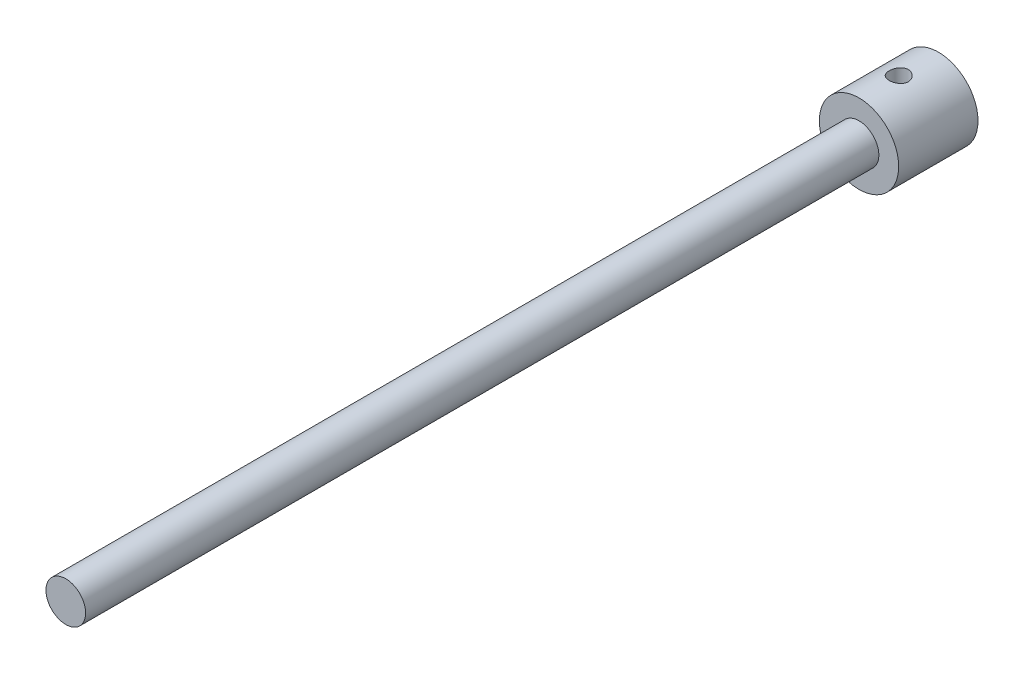
ISO-10303-21;
HEADER;
FILE_DESCRIPTION(('STEP AP214'),'2;1');
FILE_NAME('part.step','',(''),(''),'','','');
FILE_SCHEMA(('AUTOMOTIVE_DESIGN { 1 0 10303 214 1 1 1 1 }'));
ENDSEC;
DATA;
#1=APPLICATION_CONTEXT('core data for automotive mechanical design processes');
#2=APPLICATION_PROTOCOL_DEFINITION('international standard','automotive_design',2000,#1);
#3=PRODUCT_CONTEXT('',#1,'mechanical');
#4=PRODUCT('Part','Part','',(#3));
#5=PRODUCT_RELATED_PRODUCT_CATEGORY('part','',(#4));
#6=PRODUCT_DEFINITION_FORMATION('','',#4);
#7=PRODUCT_DEFINITION_CONTEXT('part definition',#1,'design');
#8=PRODUCT_DEFINITION('design','',#6,#7);
#9=PRODUCT_DEFINITION_SHAPE('','',#8);
#10=(LENGTH_UNIT() NAMED_UNIT(*) SI_UNIT(.MILLI.,.METRE.));
#11=(NAMED_UNIT(*) PLANE_ANGLE_UNIT() SI_UNIT($,.RADIAN.));
#12=(NAMED_UNIT(*) SI_UNIT($,.STERADIAN.) SOLID_ANGLE_UNIT());
#13=UNCERTAINTY_MEASURE_WITH_UNIT(LENGTH_MEASURE(1.E-05),#10,'distance_accuracy_value','');
#14=(GEOMETRIC_REPRESENTATION_CONTEXT(3) GLOBAL_UNCERTAINTY_ASSIGNED_CONTEXT((#13)) GLOBAL_UNIT_ASSIGNED_CONTEXT((#10,
#11,#12)) REPRESENTATION_CONTEXT('',''));
#15=CARTESIAN_POINT('',(0.,0.,0.));
#16=DIRECTION('',(0.,0.,1.));
#17=DIRECTION('',(1.,0.,0.));
#18=AXIS2_PLACEMENT_3D('',#15,#16,#17);
#19=CARTESIAN_POINT('',(0.,0.,50.));
#20=DIRECTION('',(0.,0.,-1.));
#21=DIRECTION('',(-1.,0.,0.));
#22=AXIS2_PLACEMENT_3D('',#19,#20,#21);
#23=CYLINDRICAL_SURFACE('',#22,25.);
#24=CARTESIAN_POINT('',(0.,-25.,31.));
#25=CARTESIAN_POINT('',(0.166017736340745,-25.0000026804997,31.0000045654021));
#26=CARTESIAN_POINT('',(0.331984064130571,-24.9983437383731,30.9931083315099));
#27=CARTESIAN_POINT('',(0.662757375273785,-24.9917601768854,30.9655909900526));
#28=CARTESIAN_POINT('',(0.827564209779564,-24.9868351457074,30.9449681517169));
#29=CARTESIAN_POINT('',(1.15483168687375,-24.9738504635424,30.8901535848326));
#30=CARTESIAN_POINT('',(1.31729147606247,-24.9657897007271,30.855957043403));
#31=CARTESIAN_POINT('',(1.63872050759381,-24.9467537443302,30.7742619207701));
#32=CARTESIAN_POINT('',(1.79768844089951,-24.9357774773038,30.7267584397992));
#33=CARTESIAN_POINT('',(2.11072366381165,-24.9112316091515,30.6189154000372));
#34=CARTESIAN_POINT('',(2.26479812859838,-24.897666030887,30.5585957367627));
#35=CARTESIAN_POINT('',(2.56731972417304,-24.8682925860487,30.4255126504005));
#36=CARTESIAN_POINT('',(2.71576475309531,-24.8524838922068,30.3527446342751));
#37=CARTESIAN_POINT('',(3.00593509691774,-24.8190587739081,30.1953429094483));
#38=CARTESIAN_POINT('',(3.14766294672407,-24.8014430394569,30.1107137253609));
#39=CARTESIAN_POINT('',(3.42359889441685,-24.7648612187919,29.930128760191));
#40=CARTESIAN_POINT('',(3.55780414185136,-24.7458946268123,29.8341687278593));
#41=CARTESIAN_POINT('',(3.81996752921303,-24.7067947855154,29.6298945004368));
#42=CARTESIAN_POINT('',(3.94778319107671,-24.6866473068088,29.5214001376863));
#43=CARTESIAN_POINT('',(4.19391043753479,-24.6460277155742,29.2940876458784));
#44=CARTESIAN_POINT('',(4.31221847908384,-24.6255554853983,29.1752657022346));
#45=CARTESIAN_POINT('',(4.53846894982133,-24.5848634527513,28.9281491358483));
#46=CARTESIAN_POINT('',(4.64641408237687,-24.5646435856504,28.7998569991231));
#47=CARTESIAN_POINT('',(4.85128465634762,-24.5250062264423,28.5345631328875));
#48=CARTESIAN_POINT('',(4.94820601608992,-24.5055890332168,28.3975582064557));
#49=CARTESIAN_POINT('',(5.1315149308875,-24.4678652790419,28.1139109412451));
#50=CARTESIAN_POINT('',(5.21774615640803,-24.4495768107614,27.9671650785524));
#51=CARTESIAN_POINT('',(5.37754406139993,-24.4149279468241,27.6666458172853));
#52=CARTESIAN_POINT('',(5.45110595933349,-24.3985682798489,27.5128697930405));
#53=CARTESIAN_POINT('',(5.58492026214268,-24.3682865029779,27.1994677660297));
#54=CARTESIAN_POINT('',(5.64517912327471,-24.354363211339,27.0398446450393));
#55=CARTESIAN_POINT('',(5.75195806967358,-24.3293636773731,26.7158528745254));
#56=CARTESIAN_POINT('',(5.79847322039683,-24.318288457803,26.5514825437586));
#57=CARTESIAN_POINT('',(5.91523377010968,-24.2902598679583,26.0591991958386));
#58=CARTESIAN_POINT('',(5.96534620186162,-24.2778811042379,25.7258747491139));
#59=CARTESIAN_POINT('',(5.99819895021148,-24.2697663322526,25.2235243982438));
#60=CARTESIAN_POINT('',(6.00209048242323,-24.2688053008257,25.055614512631));
#61=CARTESIAN_POINT('',(5.99581246294926,-24.2703574949623,24.7200533387406));
#62=CARTESIAN_POINT('',(5.98564275494965,-24.2728707591485,24.5524020533586));
#63=CARTESIAN_POINT('',(5.93483975630032,-24.285368999466,24.0592354379643));
#64=CARTESIAN_POINT('',(5.87440247397774,-24.3001939850224,23.7356610926301));
#65=CARTESIAN_POINT('',(5.70184242669472,-24.3412549446464,23.1035551402389));
#66=CARTESIAN_POINT('',(5.58971623816142,-24.3674916745551,22.7950245310886));
#67=CARTESIAN_POINT('',(5.3158825349441,-24.4286958367201,22.1981876883057));
#68=CARTESIAN_POINT('',(5.15371899452585,-24.4637429965247,21.9100987536133));
#69=CARTESIAN_POINT('',(4.78473374953622,-24.5385748778448,21.3647873385141));
#70=CARTESIAN_POINT('',(4.57790479882186,-24.5783603675971,21.1075698769834));
#71=CARTESIAN_POINT('',(4.11902988641842,-24.6594640880418,20.6242138778088));
#72=CARTESIAN_POINT('',(3.86594129003371,-24.7007951674045,20.3990660746999));
#73=CARTESIAN_POINT('',(3.32511184695823,-24.7793903091839,19.9942302876759));
#74=CARTESIAN_POINT('',(3.03737009894219,-24.8166542657671,19.8145434865743));
#75=CARTESIAN_POINT('',(2.43405695507431,-24.8830789940348,19.5054056318309));
#76=CARTESIAN_POINT('',(2.11840557448716,-24.9122154123614,19.3761051057317));
#77=CARTESIAN_POINT('',(1.46899521159138,-24.9589240940734,19.1726698236987));
#78=CARTESIAN_POINT('',(1.13523942521409,-24.9764983913503,19.0985253649671));
#79=CARTESIAN_POINT('',(0.467574800827576,-24.9978055089126,19.0089958704804));
#80=CARTESIAN_POINT('',(0.133856966575299,-25.0018564268946,18.9922601968733));
#81=CARTESIAN_POINT('',(-0.531608768658084,-24.9965614831509,19.0143335519038));
#82=CARTESIAN_POINT('',(-0.863356829944318,-24.9872167270307,19.053137996564));
#83=CARTESIAN_POINT('',(-1.51084514007902,-24.9563832816127,19.1840738854237));
#84=CARTESIAN_POINT('',(-1.8267410839496,-24.9350603275565,19.2754779523593));
#85=CARTESIAN_POINT('',(-2.4387066749497,-24.8826669936479,19.5081966502045));
#86=CARTESIAN_POINT('',(-2.73477441187556,-24.8515956762951,19.6495160816406));
#87=CARTESIAN_POINT('',(-3.30412273668564,-24.7823820658762,19.9807321749523));
#88=CARTESIAN_POINT('',(-3.57694246966835,-24.7441307708391,20.171397626969));
#89=CARTESIAN_POINT('',(-4.08719914724013,-24.6649871461435,20.5949176655097));
#90=CARTESIAN_POINT('',(-4.32463047973872,-24.6240943990595,20.8277789307352));
#91=CARTESIAN_POINT('',(-4.76284500809665,-24.5431489449983,21.3352671241417));
#92=CARTESIAN_POINT('',(-4.96268414096836,-24.5031358001301,21.6107154179113));
#93=CARTESIAN_POINT('',(-5.31333575577366,-24.4295058119813,22.1922356795911));
#94=CARTESIAN_POINT('',(-5.46415043292341,-24.395888682328,22.4983062754937));
#95=CARTESIAN_POINT('',(-5.64963439053452,-24.353347630646,22.9725936839859));
#96=CARTESIAN_POINT('',(-5.70458710242878,-24.3405033891164,23.1328069566145));
#97=CARTESIAN_POINT('',(-5.80079732294279,-24.317755202926,23.4574820200321));
#98=CARTESIAN_POINT('',(-5.84205998439171,-24.3078501521252,23.6219421871433));
#99=CARTESIAN_POINT('',(-5.91053741786634,-24.2912903166139,23.9539179032293));
#100=CARTESIAN_POINT('',(-5.93775173433046,-24.2846356373073,24.1214335511052));
#101=CARTESIAN_POINT('',(-5.97789965204539,-24.2747841701866,24.4582664668551));
#102=CARTESIAN_POINT('',(-5.99083389159895,-24.2715872278157,24.6275836538608));
#103=CARTESIAN_POINT('',(-6.00215499594078,-24.2687899616173,24.9622487305118));
#104=CARTESIAN_POINT('',(-6.00091722515411,-24.2690968340135,25.1275832844736));
#105=CARTESIAN_POINT('',(-5.9848087278487,-24.2730742483489,25.4575435219348));
#106=CARTESIAN_POINT('',(-5.96993829850501,-24.2767447169658,25.6221692208079));
#107=CARTESIAN_POINT('',(-5.92668661056588,-24.2873399112073,25.9495546015662));
#108=CARTESIAN_POINT('',(-5.89830323162515,-24.294265147542,26.1123139864983));
#109=CARTESIAN_POINT('',(-5.82827196779405,-24.3111608262961,26.4347302014815));
#110=CARTESIAN_POINT('',(-5.78662876790753,-24.3211301931022,26.5943881062501));
#111=CARTESIAN_POINT('',(-5.69063662986335,-24.3437686465433,26.9088075189712));
#112=CARTESIAN_POINT('',(-5.63634876916799,-24.3564247302984,27.0635886271826));
#113=CARTESIAN_POINT('',(-5.51539707483437,-24.3840980883562,27.3679533881392));
#114=CARTESIAN_POINT('',(-5.44873755154826,-24.3991145400161,27.5175388295994));
#115=CARTESIAN_POINT('',(-5.30348427217982,-24.4310987091682,27.8106621669156));
#116=CARTESIAN_POINT('',(-5.22488523075194,-24.4480672900111,27.9541973483356));
#117=CARTESIAN_POINT('',(-5.05635243091258,-24.4834782828489,28.2341911451689));
#118=CARTESIAN_POINT('',(-4.96642242689347,-24.5019202059306,28.3706520835145));
#119=CARTESIAN_POINT('',(-4.77346921711415,-24.5402505889388,28.6389503832923));
#120=CARTESIAN_POINT('',(-4.67017903544834,-24.5601634300573,28.7705923311298));
#121=CARTESIAN_POINT('',(-4.45304880482869,-24.600458146359,29.02470841849));
#122=CARTESIAN_POINT('',(-4.33921237965749,-24.6208398586377,29.1471856811229));
#123=CARTESIAN_POINT('',(-4.10164015488732,-24.661530300392,29.3822931129819));
#124=CARTESIAN_POINT('',(-3.97789855094998,-24.6818389796797,29.4949174263774));
#125=CARTESIAN_POINT('',(-3.7214296777047,-24.7218081005976,29.7094481047576));
#126=CARTESIAN_POINT('',(-3.58870570477298,-24.7414687761375,29.8113583669331));
#127=CARTESIAN_POINT('',(-3.31280088827595,-24.7799327781137,30.0054239224955));
#128=CARTESIAN_POINT('',(-3.16948213881108,-24.7987162302532,30.0973872483625));
#129=CARTESIAN_POINT('',(-2.8754381763477,-24.8345280560803,30.2688530722884));
#130=CARTESIAN_POINT('',(-2.72471571591035,-24.8515570748485,30.3483601559727));
#131=CARTESIAN_POINT('',(-2.41692354679156,-24.883375777664,30.4943122871475));
#132=CARTESIAN_POINT('',(-2.25985686316147,-24.8981665133663,30.5607634733439));
#133=CARTESIAN_POINT('',(-1.94048744711081,-24.9250921884147,30.6801042720391));
#134=CARTESIAN_POINT('',(-1.77818555787967,-24.9372275530119,30.7329960562763));
#135=CARTESIAN_POINT('',(-1.35190448336008,-24.9647957983314,30.8520251734541));
#136=CARTESIAN_POINT('',(-1.08469226075993,-24.9779181465939,30.9074241484908));
#137=CARTESIAN_POINT('',(-0.544940331071898,-24.9955177731159,30.9814066442059));
#138=CARTESIAN_POINT('',(-0.272400964328513,-24.9999956018512,30.999992509114));
#139=CARTESIAN_POINT('',(0.,-25.,31.));
#140=B_SPLINE_CURVE_WITH_KNOTS('',3,(#24,#25,#26,#27,#28,#29,#30,#31,#32,#33,#34,#35,#36,#37,
#38,#39,#40,#41,#42,#43,#44,#45,#46,#47,#48,#49,#50,#51,#52,#53,#54,#55,#56,#57,#58,#59,#60,#61,
#62,#63,#64,#65,#66,#67,#68,#69,#70,#71,#72,#73,#74,#75,#76,#77,#78,#79,#80,#81,#82,#83,#84,#85,
#86,#87,#88,#89,#90,#91,#92,#93,#94,#95,#96,#97,#98,#99,#100,#101,#102,#103,#104,#105,#106,#107,
#108,#109,#110,#111,#112,#113,#114,#115,#116,#117,#118,#119,#120,#121,#122,#123,#124,#125,#126,
#127,#128,#129,#130,#131,#132,#133,#134,#135,#136,#137,#138,#139),.UNSPECIFIED.,.T.,.F.,(4,2,2,
2,2,2,2,2,2,2,2,2,2,2,2,2,2,2,2,2,2,2,2,2,2,2,2,2,2,2,2,2,2,2,2,2,2,2,2,2,2,2,2,2,2,2,2,2,2,2,2,
2,2,2,2,2,2,4),(0.,0.497813360100955,0.995689500769748,1.49374233325073,1.99197879609469,
2.4894473877073,2.98709992652941,3.48456314269129,3.98221359994714,4.48820831908741,
4.99439073274951,5.50044073797176,6.00667750796929,6.51961190143619,7.03273945954076,
7.54561743540079,8.05867933189507,9.06463756237654,9.56800871792682,10.0713854693234,
11.0548629550303,12.0384055899336,13.0311908061742,14.0241372047509,15.0430966233895,
16.0620825507942,17.0840897493149,18.1059171185591,19.1035329919673,20.1010665323702,
21.085126203147,22.069280539993,23.0698021185097,24.0704821968969,25.0936623603892,
26.1167967016263,26.6258643414059,27.1347401541084,27.6436324676663,28.1525020334114,
28.6479253897995,29.1433379468293,29.6388282657176,30.1341437102249,30.6271145113295,
31.1199138801487,31.6129320389054,32.105787268885,32.6107272666003,33.1154944014541,
33.6205595212516,34.1254402854413,34.6387770201076,35.1519243293048,35.6648297831432,
36.1776530362049,36.9945144051894,37.8113237554193),.UNSPECIFIED.);
#141=CARTESIAN_POINT('',(0.,-25.,31.));
#142=VERTEX_POINT('',#141);
#143=EDGE_CURVE('E10',#142,#142,#140,.T.);
#144=ORIENTED_EDGE('',*,*,#143,.T.);
#145=EDGE_LOOP('',(#144));
#146=FACE_BOUND('',#145,.T.);
#147=CARTESIAN_POINT('',(0.,25.,31.));
#148=CARTESIAN_POINT('',(-0.166017736340745,25.0000026804997,31.0000045654021));
#149=CARTESIAN_POINT('',(-0.331984064130571,24.9983437383731,30.9931083315099));
#150=CARTESIAN_POINT('',(-0.662757375273785,24.9917601768854,30.9655909900526));
#151=CARTESIAN_POINT('',(-0.827564209779564,24.9868351457074,30.9449681517169));
#152=CARTESIAN_POINT('',(-1.15483168687375,24.9738504635424,30.8901535848326));
#153=CARTESIAN_POINT('',(-1.31729147606247,24.9657897007271,30.855957043403));
#154=CARTESIAN_POINT('',(-1.63872050759381,24.9467537443302,30.7742619207701));
#155=CARTESIAN_POINT('',(-1.79768844089951,24.9357774773038,30.7267584397992));
#156=CARTESIAN_POINT('',(-2.11072366381165,24.9112316091515,30.6189154000372));
#157=CARTESIAN_POINT('',(-2.26479812859838,24.897666030887,30.5585957367627));
#158=CARTESIAN_POINT('',(-2.56731972417304,24.8682925860487,30.4255126504005));
#159=CARTESIAN_POINT('',(-2.71576475309531,24.8524838922068,30.3527446342751));
#160=CARTESIAN_POINT('',(-3.00593509691774,24.8190587739081,30.1953429094483));
#161=CARTESIAN_POINT('',(-3.14766294672407,24.8014430394569,30.1107137253609));
#162=CARTESIAN_POINT('',(-3.42359889441685,24.7648612187919,29.930128760191));
#163=CARTESIAN_POINT('',(-3.55780414185136,24.7458946268123,29.8341687278593));
#164=CARTESIAN_POINT('',(-3.81996752921303,24.7067947855154,29.6298945004368));
#165=CARTESIAN_POINT('',(-3.94778319107671,24.6866473068088,29.5214001376863));
#166=CARTESIAN_POINT('',(-4.19391043753479,24.6460277155742,29.2940876458784));
#167=CARTESIAN_POINT('',(-4.31221847908384,24.6255554853983,29.1752657022346));
#168=CARTESIAN_POINT('',(-4.53846894982133,24.5848634527513,28.9281491358483));
#169=CARTESIAN_POINT('',(-4.64641408237687,24.5646435856504,28.7998569991231));
#170=CARTESIAN_POINT('',(-4.85128465634762,24.5250062264423,28.5345631328875));
#171=CARTESIAN_POINT('',(-4.94820601608992,24.5055890332168,28.3975582064557));
#172=CARTESIAN_POINT('',(-5.1315149308875,24.4678652790419,28.1139109412451));
#173=CARTESIAN_POINT('',(-5.21774615640803,24.4495768107614,27.9671650785524));
#174=CARTESIAN_POINT('',(-5.37754406139993,24.4149279468241,27.6666458172853));
#175=CARTESIAN_POINT('',(-5.45110595933349,24.3985682798489,27.5128697930405));
#176=CARTESIAN_POINT('',(-5.58492026214268,24.3682865029779,27.1994677660297));
#177=CARTESIAN_POINT('',(-5.64517912327471,24.354363211339,27.0398446450393));
#178=CARTESIAN_POINT('',(-5.75195806967358,24.3293636773731,26.7158528745254));
#179=CARTESIAN_POINT('',(-5.79847322039683,24.318288457803,26.5514825437586));
#180=CARTESIAN_POINT('',(-5.91523377010968,24.2902598679583,26.0591991958386));
#181=CARTESIAN_POINT('',(-5.96534620186162,24.2778811042379,25.7258747491139));
#182=CARTESIAN_POINT('',(-5.99819895021148,24.2697663322526,25.2235243982438));
#183=CARTESIAN_POINT('',(-6.00209048242323,24.2688053008257,25.055614512631));
#184=CARTESIAN_POINT('',(-5.99581246294926,24.2703574949623,24.7200533387406));
#185=CARTESIAN_POINT('',(-5.98564275494965,24.2728707591485,24.5524020533586));
#186=CARTESIAN_POINT('',(-5.93483975630032,24.285368999466,24.0592354379643));
#187=CARTESIAN_POINT('',(-5.87440247397774,24.3001939850224,23.7356610926301));
#188=CARTESIAN_POINT('',(-5.70184242669472,24.3412549446464,23.1035551402389));
#189=CARTESIAN_POINT('',(-5.58971623816142,24.3674916745551,22.7950245310886));
#190=CARTESIAN_POINT('',(-5.3158825349441,24.4286958367201,22.1981876883057));
#191=CARTESIAN_POINT('',(-5.15371899452585,24.4637429965247,21.9100987536133));
#192=CARTESIAN_POINT('',(-4.78473374953622,24.5385748778448,21.3647873385141));
#193=CARTESIAN_POINT('',(-4.57790479882186,24.5783603675971,21.1075698769834));
#194=CARTESIAN_POINT('',(-4.11902988641842,24.6594640880418,20.6242138778088));
#195=CARTESIAN_POINT('',(-3.86594129003371,24.7007951674045,20.3990660746999));
#196=CARTESIAN_POINT('',(-3.32511184695823,24.7793903091839,19.9942302876759));
#197=CARTESIAN_POINT('',(-3.03737009894219,24.8166542657671,19.8145434865743));
#198=CARTESIAN_POINT('',(-2.43405695507431,24.8830789940348,19.5054056318309));
#199=CARTESIAN_POINT('',(-2.11840557448716,24.9122154123614,19.3761051057317));
#200=CARTESIAN_POINT('',(-1.46899521159138,24.9589240940734,19.1726698236987));
#201=CARTESIAN_POINT('',(-1.13523942521409,24.9764983913503,19.0985253649671));
#202=CARTESIAN_POINT('',(-0.467574800827576,24.9978055089126,19.0089958704804));
#203=CARTESIAN_POINT('',(-0.133856966575299,25.0018564268946,18.9922601968733));
#204=CARTESIAN_POINT('',(0.531608768658084,24.9965614831509,19.0143335519038));
#205=CARTESIAN_POINT('',(0.863356829944318,24.9872167270307,19.053137996564));
#206=CARTESIAN_POINT('',(1.51084514007902,24.9563832816127,19.1840738854237));
#207=CARTESIAN_POINT('',(1.8267410839496,24.9350603275565,19.2754779523593));
#208=CARTESIAN_POINT('',(2.4387066749497,24.8826669936479,19.5081966502045));
#209=CARTESIAN_POINT('',(2.73477441187556,24.8515956762951,19.6495160816406));
#210=CARTESIAN_POINT('',(3.30412273668564,24.7823820658762,19.9807321749523));
#211=CARTESIAN_POINT('',(3.57694246966835,24.7441307708391,20.171397626969));
#212=CARTESIAN_POINT('',(4.08719914724013,24.6649871461435,20.5949176655097));
#213=CARTESIAN_POINT('',(4.32463047973872,24.6240943990595,20.8277789307352));
#214=CARTESIAN_POINT('',(4.76284500809665,24.5431489449983,21.3352671241417));
#215=CARTESIAN_POINT('',(4.96268414096836,24.5031358001301,21.6107154179113));
#216=CARTESIAN_POINT('',(5.31333575577366,24.4295058119813,22.1922356795911));
#217=CARTESIAN_POINT('',(5.46415043292341,24.395888682328,22.4983062754937));
#218=CARTESIAN_POINT('',(5.64963439053452,24.353347630646,22.9725936839859));
#219=CARTESIAN_POINT('',(5.70458710242878,24.3405033891164,23.1328069566145));
#220=CARTESIAN_POINT('',(5.80079732294279,24.317755202926,23.4574820200321));
#221=CARTESIAN_POINT('',(5.84205998439171,24.3078501521252,23.6219421871433));
#222=CARTESIAN_POINT('',(5.91053741786634,24.2912903166139,23.9539179032293));
#223=CARTESIAN_POINT('',(5.93775173433046,24.2846356373073,24.1214335511052));
#224=CARTESIAN_POINT('',(5.97789965204539,24.2747841701866,24.4582664668551));
#225=CARTESIAN_POINT('',(5.99083389159895,24.2715872278157,24.6275836538608));
#226=CARTESIAN_POINT('',(6.00215499594078,24.2687899616173,24.9622487305118));
#227=CARTESIAN_POINT('',(6.00091722515411,24.2690968340135,25.1275832844736));
#228=CARTESIAN_POINT('',(5.9848087278487,24.2730742483489,25.4575435219348));
#229=CARTESIAN_POINT('',(5.96993829850501,24.2767447169658,25.6221692208079));
#230=CARTESIAN_POINT('',(5.92668661056588,24.2873399112073,25.9495546015662));
#231=CARTESIAN_POINT('',(5.89830323162515,24.294265147542,26.1123139864983));
#232=CARTESIAN_POINT('',(5.82827196779405,24.3111608262961,26.4347302014815));
#233=CARTESIAN_POINT('',(5.78662876790753,24.3211301931022,26.5943881062501));
#234=CARTESIAN_POINT('',(5.69063662986335,24.3437686465433,26.9088075189712));
#235=CARTESIAN_POINT('',(5.63634876916799,24.3564247302984,27.0635886271826));
#236=CARTESIAN_POINT('',(5.51539707483437,24.3840980883562,27.3679533881392));
#237=CARTESIAN_POINT('',(5.44873755154826,24.3991145400161,27.5175388295994));
#238=CARTESIAN_POINT('',(5.30348427217982,24.4310987091682,27.8106621669156));
#239=CARTESIAN_POINT('',(5.22488523075194,24.4480672900111,27.9541973483356));
#240=CARTESIAN_POINT('',(5.05635243091258,24.4834782828489,28.2341911451689));
#241=CARTESIAN_POINT('',(4.96642242689347,24.5019202059306,28.3706520835145));
#242=CARTESIAN_POINT('',(4.77346921711415,24.5402505889388,28.6389503832923));
#243=CARTESIAN_POINT('',(4.67017903544834,24.5601634300573,28.7705923311298));
#244=CARTESIAN_POINT('',(4.45304880482869,24.600458146359,29.02470841849));
#245=CARTESIAN_POINT('',(4.33921237965749,24.6208398586377,29.1471856811229));
#246=CARTESIAN_POINT('',(4.10164015488732,24.661530300392,29.3822931129819));
#247=CARTESIAN_POINT('',(3.97789855094998,24.6818389796797,29.4949174263774));
#248=CARTESIAN_POINT('',(3.7214296777047,24.7218081005976,29.7094481047576));
#249=CARTESIAN_POINT('',(3.58870570477298,24.7414687761375,29.8113583669331));
#250=CARTESIAN_POINT('',(3.31280088827595,24.7799327781137,30.0054239224955));
#251=CARTESIAN_POINT('',(3.16948213881108,24.7987162302532,30.0973872483625));
#252=CARTESIAN_POINT('',(2.8754381763477,24.8345280560803,30.2688530722884));
#253=CARTESIAN_POINT('',(2.72471571591035,24.8515570748485,30.3483601559727));
#254=CARTESIAN_POINT('',(2.41692354679156,24.883375777664,30.4943122871475));
#255=CARTESIAN_POINT('',(2.25985686316147,24.8981665133663,30.5607634733439));
#256=CARTESIAN_POINT('',(1.94048744711081,24.9250921884147,30.6801042720391));
#257=CARTESIAN_POINT('',(1.77818555787967,24.9372275530119,30.7329960562763));
#258=CARTESIAN_POINT('',(1.35190448336008,24.9647957983314,30.8520251734541));
#259=CARTESIAN_POINT('',(1.08469226075993,24.9779181465939,30.9074241484908));
#260=CARTESIAN_POINT('',(0.544940331071898,24.9955177731159,30.9814066442059));
#261=CARTESIAN_POINT('',(0.272400964328513,24.9999956018512,30.999992509114));
#262=CARTESIAN_POINT('',(0.,25.,31.));
#263=B_SPLINE_CURVE_WITH_KNOTS('',3,(#147,#148,#149,#150,#151,#152,#153,#154,#155,#156,#157,
#158,#159,#160,#161,#162,#163,#164,#165,#166,#167,#168,#169,#170,#171,#172,#173,#174,#175,#176,
#177,#178,#179,#180,#181,#182,#183,#184,#185,#186,#187,#188,#189,#190,#191,#192,#193,#194,#195,
#196,#197,#198,#199,#200,#201,#202,#203,#204,#205,#206,#207,#208,#209,#210,#211,#212,#213,#214,
#215,#216,#217,#218,#219,#220,#221,#222,#223,#224,#225,#226,#227,#228,#229,#230,#231,#232,#233,
#234,#235,#236,#237,#238,#239,#240,#241,#242,#243,#244,#245,#246,#247,#248,#249,#250,#251,#252,
#253,#254,#255,#256,#257,#258,#259,#260,#261,#262),.UNSPECIFIED.,.T.,.F.,(4,2,2,2,2,2,2,2,2,2,2,
2,2,2,2,2,2,2,2,2,2,2,2,2,2,2,2,2,2,2,2,2,2,2,2,2,2,2,2,2,2,2,2,2,2,2,2,2,2,2,2,2,2,2,2,2,2,4),
(0.,0.497813360100955,0.995689500769748,1.49374233325073,1.99197879609469,2.4894473877073,
2.98709992652941,3.48456314269129,3.98221359994714,4.48820831908741,4.99439073274951,
5.50044073797176,6.00667750796929,6.51961190143619,7.03273945954076,7.54561743540079,
8.05867933189507,9.06463756237654,9.56800871792682,10.0713854693234,11.0548629550303,
12.0384055899336,13.0311908061742,14.0241372047509,15.0430966233895,16.0620825507942,
17.0840897493149,18.1059171185591,19.1035329919673,20.1010665323702,21.085126203147,
22.069280539993,23.0698021185097,24.0704821968969,25.0936623603892,26.1167967016263,
26.6258643414059,27.1347401541084,27.6436324676663,28.1525020334114,28.6479253897995,
29.1433379468293,29.6388282657176,30.1341437102249,30.6271145113295,31.1199138801487,
31.6129320389054,32.105787268885,32.6107272666003,33.1154944014541,33.6205595212516,
34.1254402854413,34.6387770201076,35.1519243293048,35.6648297831432,36.1776530362049,
36.9945144051894,37.8113237554193),.UNSPECIFIED.);
#264=CARTESIAN_POINT('',(0.,25.,31.));
#265=VERTEX_POINT('',#264);
#266=EDGE_CURVE('E45',#265,#265,#263,.T.);
#267=ORIENTED_EDGE('',*,*,#266,.T.);
#268=EDGE_LOOP('',(#267));
#269=FACE_BOUND('',#268,.T.);
#270=CARTESIAN_POINT('',(0.,0.,50.));
#271=DIRECTION('',(0.,0.,1.));
#272=DIRECTION('',(1.,0.,0.));
#273=AXIS2_PLACEMENT_3D('',#270,#271,#272);
#274=CIRCLE('',#273,25.);
#275=CARTESIAN_POINT('',(25.,0.,50.));
#276=VERTEX_POINT('',#275);
#277=EDGE_CURVE('E49',#276,#276,#274,.T.);
#278=ORIENTED_EDGE('',*,*,#277,.F.);
#279=EDGE_LOOP('',(#278));
#280=FACE_BOUND('',#279,.T.);
#281=CARTESIAN_POINT('',(0.,0.,0.));
#282=DIRECTION('',(0.,0.,1.));
#283=DIRECTION('',(1.,0.,0.));
#284=AXIS2_PLACEMENT_3D('',#281,#282,#283);
#285=CIRCLE('',#284,25.);
#286=CARTESIAN_POINT('',(25.,0.,0.));
#287=VERTEX_POINT('',#286);
#288=EDGE_CURVE('E53',#287,#287,#285,.T.);
#289=ORIENTED_EDGE('',*,*,#288,.T.);
#290=EDGE_LOOP('',(#289));
#291=FACE_BOUND('',#290,.T.);
#292=ADVANCED_FACE('F35',(#146,#269,#280,#291),#23,.T.);
#293=CARTESIAN_POINT('',(0.,0.,50.));
#294=DIRECTION('',(0.,0.,1.));
#295=DIRECTION('',(1.,0.,0.));
#296=AXIS2_PLACEMENT_3D('',#293,#294,#295);
#297=PLANE('',#296);
#298=CARTESIAN_POINT('',(0.,0.,50.));
#299=DIRECTION('',(0.,0.,1.));
#300=DIRECTION('',(1.,0.,0.));
#301=AXIS2_PLACEMENT_3D('',#298,#299,#300);
#302=CIRCLE('',#301,12.5);
#303=CARTESIAN_POINT('',(12.5,0.,50.));
#304=VERTEX_POINT('',#303);
#305=EDGE_CURVE('E88',#304,#304,#302,.F.);
#306=ORIENTED_EDGE('',*,*,#305,.T.);
#307=EDGE_LOOP('',(#306));
#308=FACE_BOUND('',#307,.T.);
#309=ORIENTED_EDGE('',*,*,#277,.T.);
#310=EDGE_LOOP('',(#309));
#311=FACE_BOUND('',#310,.T.);
#312=ADVANCED_FACE('F73',(#308,#311),#297,.T.);
#313=CARTESIAN_POINT('',(0.,0.,0.));
#314=DIRECTION('',(0.,0.,1.));
#315=DIRECTION('',(1.,0.,0.));
#316=AXIS2_PLACEMENT_3D('',#313,#314,#315);
#317=PLANE('',#316);
#318=ORIENTED_EDGE('',*,*,#288,.F.);
#319=EDGE_LOOP('',(#318));
#320=FACE_BOUND('',#319,.T.);
#321=ADVANCED_FACE('F71',(#320),#317,.F.);
#322=CARTESIAN_POINT('',(0.,0.,550.));
#323=DIRECTION('',(0.,0.,-1.));
#324=DIRECTION('',(-1.,0.,0.));
#325=AXIS2_PLACEMENT_3D('',#322,#323,#324);
#326=CYLINDRICAL_SURFACE('',#325,12.5);
#327=ORIENTED_EDGE('',*,*,#305,.F.);
#328=EDGE_LOOP('',(#327));
#329=FACE_BOUND('',#328,.T.);
#330=CARTESIAN_POINT('',(0.,0.,550.));
#331=DIRECTION('',(0.,0.,1.));
#332=DIRECTION('',(1.,0.,0.));
#333=AXIS2_PLACEMENT_3D('',#330,#331,#332);
#334=CIRCLE('',#333,12.5);
#335=CARTESIAN_POINT('',(12.5,0.,550.));
#336=VERTEX_POINT('',#335);
#337=EDGE_CURVE('E90',#336,#336,#334,.T.);
#338=ORIENTED_EDGE('',*,*,#337,.F.);
#339=EDGE_LOOP('',(#338));
#340=FACE_BOUND('',#339,.T.);
#341=ADVANCED_FACE('F67',(#329,#340),#326,.T.);
#342=CARTESIAN_POINT('',(0.,0.,550.));
#343=DIRECTION('',(0.,0.,1.));
#344=DIRECTION('',(1.,0.,0.));
#345=AXIS2_PLACEMENT_3D('',#342,#343,#344);
#346=PLANE('',#345);
#347=ORIENTED_EDGE('',*,*,#337,.T.);
#348=EDGE_LOOP('',(#347));
#349=FACE_BOUND('',#348,.T.);
#350=ADVANCED_FACE('F62',(#349),#346,.T.);
#351=CARTESIAN_POINT('',(0.,-25.,25.));
#352=DIRECTION('',(0.,1.,0.));
#353=DIRECTION('',(0.,0.,1.));
#354=AXIS2_PLACEMENT_3D('',#351,#352,#353);
#355=CYLINDRICAL_SURFACE('',#354,6.);
#356=ORIENTED_EDGE('',*,*,#266,.F.);
#357=EDGE_LOOP('',(#356));
#358=FACE_BOUND('',#357,.T.);
#359=ORIENTED_EDGE('',*,*,#143,.F.);
#360=EDGE_LOOP('',(#359));
#361=FACE_BOUND('',#360,.T.);
#362=ADVANCED_FACE('F58',(#358,#361),#355,.F.);
#363=CLOSED_SHELL('',(#292,#312,#321,#341,#350,#362));
#364=MANIFOLD_SOLID_BREP('B2',#363);
#365=ADVANCED_BREP_SHAPE_REPRESENTATION('',(#18,#364),#14);
#366=SHAPE_DEFINITION_REPRESENTATION(#9,#365);
ENDSEC;
END-ISO-10303-21;
